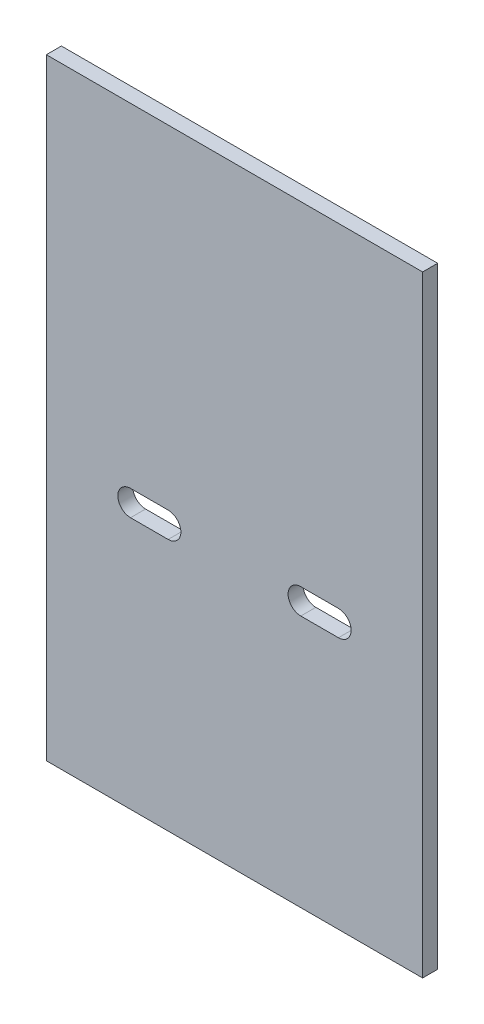
ISO-10303-21;
HEADER;
FILE_DESCRIPTION(('STEP AP214'),'2;1');
FILE_NAME('part.step','',(''),(''),'','','');
FILE_SCHEMA(('AUTOMOTIVE_DESIGN { 1 0 10303 214 1 1 1 1 }'));
ENDSEC;
DATA;
#1=APPLICATION_CONTEXT('core data for automotive mechanical design processes');
#2=APPLICATION_PROTOCOL_DEFINITION('international standard','automotive_design',2000,#1);
#3=PRODUCT_CONTEXT('',#1,'mechanical');
#4=PRODUCT('Part','Part','',(#3));
#5=PRODUCT_RELATED_PRODUCT_CATEGORY('part','',(#4));
#6=PRODUCT_DEFINITION_FORMATION('','',#4);
#7=PRODUCT_DEFINITION_CONTEXT('part definition',#1,'design');
#8=PRODUCT_DEFINITION('design','',#6,#7);
#9=PRODUCT_DEFINITION_SHAPE('','',#8);
#10=(LENGTH_UNIT() NAMED_UNIT(*) SI_UNIT(.MILLI.,.METRE.));
#11=(NAMED_UNIT(*) PLANE_ANGLE_UNIT() SI_UNIT($,.RADIAN.));
#12=(NAMED_UNIT(*) SI_UNIT($,.STERADIAN.) SOLID_ANGLE_UNIT());
#13=UNCERTAINTY_MEASURE_WITH_UNIT(LENGTH_MEASURE(1.E-05),#10,'distance_accuracy_value','');
#14=(GEOMETRIC_REPRESENTATION_CONTEXT(3) GLOBAL_UNCERTAINTY_ASSIGNED_CONTEXT((#13)) GLOBAL_UNIT_ASSIGNED_CONTEXT((#10,
#11,#12)) REPRESENTATION_CONTEXT('',''));
#15=CARTESIAN_POINT('',(0.,0.,0.));
#16=DIRECTION('',(0.,0.,1.));
#17=DIRECTION('',(1.,0.,0.));
#18=AXIS2_PLACEMENT_3D('',#15,#16,#17);
#19=CARTESIAN_POINT('',(200.,-325.,-16.));
#20=DIRECTION('',(1.,0.,0.));
#21=DIRECTION('',(0.,0.,-1.));
#22=AXIS2_PLACEMENT_3D('',#19,#20,#21);
#23=PLANE('',#22);
#24=DIRECTION('',(0.,1.,0.));
#25=VECTOR('',#24,1.);
#26=CARTESIAN_POINT('',(200.,-325.,0.));
#27=LINE('',#26,#25);
#28=CARTESIAN_POINT('',(200.,-325.,0.));
#29=VERTEX_POINT('',#28);
#30=CARTESIAN_POINT('',(200.,325.,0.));
#31=VERTEX_POINT('',#30);
#32=EDGE_CURVE('E161',#29,#31,#27,.T.);
#33=ORIENTED_EDGE('',*,*,#32,.F.);
#34=DIRECTION('',(0.,0.,1.));
#35=VECTOR('',#34,1.);
#36=CARTESIAN_POINT('',(200.,-325.,-16.));
#37=LINE('',#36,#35);
#38=CARTESIAN_POINT('',(200.,-325.,-16.));
#39=VERTEX_POINT('',#38);
#40=EDGE_CURVE('E11',#39,#29,#37,.T.);
#41=ORIENTED_EDGE('',*,*,#40,.F.);
#42=DIRECTION('',(0.,1.,0.));
#43=VECTOR('',#42,1.);
#44=CARTESIAN_POINT('',(200.,-325.,-16.));
#45=LINE('',#44,#43);
#46=CARTESIAN_POINT('',(200.,325.,-16.));
#47=VERTEX_POINT('',#46);
#48=EDGE_CURVE('E194',#39,#47,#45,.T.);
#49=ORIENTED_EDGE('',*,*,#48,.T.);
#50=DIRECTION('',(0.,0.,1.));
#51=VECTOR('',#50,1.);
#52=CARTESIAN_POINT('',(200.,325.,-16.));
#53=LINE('',#52,#51);
#54=EDGE_CURVE('E37',#47,#31,#53,.T.);
#55=ORIENTED_EDGE('',*,*,#54,.T.);
#56=EDGE_LOOP('',(#33,#41,#49,#55));
#57=FACE_BOUND('',#56,.T.);
#58=ADVANCED_FACE('F34',(#57),#23,.T.);
#59=CARTESIAN_POINT('',(-200.,-325.,-16.));
#60=DIRECTION('',(0.,-1.,0.));
#61=DIRECTION('',(0.,0.,-1.));
#62=AXIS2_PLACEMENT_3D('',#59,#60,#61);
#63=PLANE('',#62);
#64=DIRECTION('',(1.,0.,0.));
#65=VECTOR('',#64,1.);
#66=CARTESIAN_POINT('',(-200.,-325.,0.));
#67=LINE('',#66,#65);
#68=CARTESIAN_POINT('',(-200.,-325.,0.));
#69=VERTEX_POINT('',#68);
#70=EDGE_CURVE('E198',#69,#29,#67,.T.);
#71=ORIENTED_EDGE('',*,*,#70,.F.);
#72=DIRECTION('',(0.,0.,1.));
#73=VECTOR('',#72,1.);
#74=CARTESIAN_POINT('',(-200.,-325.,-16.));
#75=LINE('',#74,#73);
#76=CARTESIAN_POINT('',(-200.,-325.,-16.));
#77=VERTEX_POINT('',#76);
#78=EDGE_CURVE('E42',#77,#69,#75,.T.);
#79=ORIENTED_EDGE('',*,*,#78,.F.);
#80=DIRECTION('',(1.,0.,0.));
#81=VECTOR('',#80,1.);
#82=CARTESIAN_POINT('',(-200.,-325.,-16.));
#83=LINE('',#82,#81);
#84=EDGE_CURVE('E204',#77,#39,#83,.T.);
#85=ORIENTED_EDGE('',*,*,#84,.T.);
#86=ORIENTED_EDGE('',*,*,#40,.T.);
#87=EDGE_LOOP('',(#71,#79,#85,#86));
#88=FACE_BOUND('',#87,.T.);
#89=ADVANCED_FACE('F230',(#88),#63,.T.);
#90=CARTESIAN_POINT('',(-200.,-325.,-16.));
#91=DIRECTION('',(-1.,0.,0.));
#92=DIRECTION('',(0.,0.,1.));
#93=AXIS2_PLACEMENT_3D('',#90,#91,#92);
#94=PLANE('',#93);
#95=DIRECTION('',(0.,-1.,0.));
#96=VECTOR('',#95,1.);
#97=CARTESIAN_POINT('',(-200.,-325.,0.));
#98=LINE('',#97,#96);
#99=CARTESIAN_POINT('',(-200.,325.,0.));
#100=VERTEX_POINT('',#99);
#101=EDGE_CURVE('E212',#100,#69,#98,.T.);
#102=ORIENTED_EDGE('',*,*,#101,.F.);
#103=DIRECTION('',(0.,0.,1.));
#104=VECTOR('',#103,1.);
#105=CARTESIAN_POINT('',(-200.,325.,-16.));
#106=LINE('',#105,#104);
#107=CARTESIAN_POINT('',(-200.,325.,-16.));
#108=VERTEX_POINT('',#107);
#109=EDGE_CURVE('E217',#108,#100,#106,.T.);
#110=ORIENTED_EDGE('',*,*,#109,.F.);
#111=DIRECTION('',(0.,-1.,0.));
#112=VECTOR('',#111,1.);
#113=CARTESIAN_POINT('',(-200.,-325.,-16.));
#114=LINE('',#113,#112);
#115=EDGE_CURVE('E201',#108,#77,#114,.T.);
#116=ORIENTED_EDGE('',*,*,#115,.T.);
#117=ORIENTED_EDGE('',*,*,#78,.T.);
#118=EDGE_LOOP('',(#102,#110,#116,#117));
#119=FACE_BOUND('',#118,.T.);
#120=ADVANCED_FACE('F235',(#119),#94,.T.);
#121=CARTESIAN_POINT('',(-200.,325.,-16.));
#122=DIRECTION('',(0.,1.,0.));
#123=DIRECTION('',(0.,0.,1.));
#124=AXIS2_PLACEMENT_3D('',#121,#122,#123);
#125=PLANE('',#124);
#126=DIRECTION('',(-1.,0.,0.));
#127=VECTOR('',#126,1.);
#128=CARTESIAN_POINT('',(-200.,325.,0.));
#129=LINE('',#128,#127);
#130=EDGE_CURVE('E209',#31,#100,#129,.T.);
#131=ORIENTED_EDGE('',*,*,#130,.F.);
#132=ORIENTED_EDGE('',*,*,#54,.F.);
#133=DIRECTION('',(-1.,0.,0.));
#134=VECTOR('',#133,1.);
#135=CARTESIAN_POINT('',(-200.,325.,-16.));
#136=LINE('',#135,#134);
#137=EDGE_CURVE('E197',#47,#108,#136,.T.);
#138=ORIENTED_EDGE('',*,*,#137,.T.);
#139=ORIENTED_EDGE('',*,*,#109,.T.);
#140=EDGE_LOOP('',(#131,#132,#138,#139));
#141=FACE_BOUND('',#140,.T.);
#142=ADVANCED_FACE('F225',(#141),#125,.T.);
#143=CARTESIAN_POINT('',(0.,0.,-16.));
#144=DIRECTION('',(0.,0.,-1.));
#145=DIRECTION('',(-1.,0.,0.));
#146=AXIS2_PLACEMENT_3D('',#143,#144,#145);
#147=PLANE('',#146);
#148=CARTESIAN_POINT('',(70.5,-43.,-16.));
#149=DIRECTION('',(0.,0.,1.));
#150=DIRECTION('',(1.,0.,0.));
#151=AXIS2_PLACEMENT_3D('',#148,#149,#150);
#152=CIRCLE('',#151,13.5);
#153=CARTESIAN_POINT('',(70.5,-29.5,-16.));
#154=VERTEX_POINT('',#153);
#155=CARTESIAN_POINT('',(70.5,-56.5,-16.));
#156=VERTEX_POINT('',#155);
#157=EDGE_CURVE('E127',#154,#156,#152,.T.);
#158=ORIENTED_EDGE('',*,*,#157,.T.);
#159=DIRECTION('',(1.,0.,0.));
#160=VECTOR('',#159,1.);
#161=CARTESIAN_POINT('',(70.5,-56.5,-16.));
#162=LINE('',#161,#160);
#163=CARTESIAN_POINT('',(110.5,-56.5,-16.));
#164=VERTEX_POINT('',#163);
#165=EDGE_CURVE('E138',#156,#164,#162,.T.);
#166=ORIENTED_EDGE('',*,*,#165,.T.);
#167=CARTESIAN_POINT('',(110.5,-43.,-16.));
#168=DIRECTION('',(0.,0.,1.));
#169=DIRECTION('',(1.,0.,0.));
#170=AXIS2_PLACEMENT_3D('',#167,#168,#169);
#171=CIRCLE('',#170,13.5);
#172=CARTESIAN_POINT('',(110.5,-29.5,-16.));
#173=VERTEX_POINT('',#172);
#174=EDGE_CURVE('E50',#164,#173,#171,.T.);
#175=ORIENTED_EDGE('',*,*,#174,.T.);
#176=DIRECTION('',(-1.,0.,0.));
#177=VECTOR('',#176,1.);
#178=CARTESIAN_POINT('',(70.5,-29.5,-16.));
#179=LINE('',#178,#177);
#180=EDGE_CURVE('E135',#173,#154,#179,.T.);
#181=ORIENTED_EDGE('',*,*,#180,.T.);
#182=EDGE_LOOP('',(#158,#166,#175,#181));
#183=FACE_BOUND('',#182,.T.);
#184=CARTESIAN_POINT('',(-70.5,-43.,-16.));
#185=DIRECTION('',(0.,0.,1.));
#186=DIRECTION('',(1.,0.,0.));
#187=AXIS2_PLACEMENT_3D('',#184,#185,#186);
#188=CIRCLE('',#187,13.5);
#189=CARTESIAN_POINT('',(-70.5,-56.5,-16.));
#190=VERTEX_POINT('',#189);
#191=CARTESIAN_POINT('',(-70.5,-29.5,-16.));
#192=VERTEX_POINT('',#191);
#193=EDGE_CURVE('E165',#190,#192,#188,.T.);
#194=ORIENTED_EDGE('',*,*,#193,.T.);
#195=DIRECTION('',(-1.,0.,0.));
#196=VECTOR('',#195,1.);
#197=CARTESIAN_POINT('',(-70.5,-29.5,-16.));
#198=LINE('',#197,#196);
#199=CARTESIAN_POINT('',(-110.5,-29.5,-16.));
#200=VERTEX_POINT('',#199);
#201=EDGE_CURVE('E168',#192,#200,#198,.T.);
#202=ORIENTED_EDGE('',*,*,#201,.T.);
#203=CARTESIAN_POINT('',(-110.5,-43.,-16.));
#204=DIRECTION('',(0.,0.,1.));
#205=DIRECTION('',(1.,0.,0.));
#206=AXIS2_PLACEMENT_3D('',#203,#204,#205);
#207=CIRCLE('',#206,13.5);
#208=CARTESIAN_POINT('',(-110.5,-56.5,-16.));
#209=VERTEX_POINT('',#208);
#210=EDGE_CURVE('E58',#200,#209,#207,.T.);
#211=ORIENTED_EDGE('',*,*,#210,.T.);
#212=DIRECTION('',(1.,0.,0.));
#213=VECTOR('',#212,1.);
#214=CARTESIAN_POINT('',(-70.5,-56.5,-16.));
#215=LINE('',#214,#213);
#216=EDGE_CURVE('E173',#209,#190,#215,.T.);
#217=ORIENTED_EDGE('',*,*,#216,.T.);
#218=EDGE_LOOP('',(#194,#202,#211,#217));
#219=FACE_BOUND('',#218,.T.);
#220=ORIENTED_EDGE('',*,*,#48,.F.);
#221=ORIENTED_EDGE('',*,*,#84,.F.);
#222=ORIENTED_EDGE('',*,*,#115,.F.);
#223=ORIENTED_EDGE('',*,*,#137,.F.);
#224=EDGE_LOOP('',(#220,#221,#222,#223));
#225=FACE_BOUND('',#224,.T.);
#226=ADVANCED_FACE('F142',(#183,#219,#225),#147,.T.);
#227=CARTESIAN_POINT('',(0.,0.,0.));
#228=DIRECTION('',(0.,0.,-1.));
#229=DIRECTION('',(-1.,0.,0.));
#230=AXIS2_PLACEMENT_3D('',#227,#228,#229);
#231=PLANE('',#230);
#232=DIRECTION('',(1.,0.,0.));
#233=VECTOR('',#232,1.);
#234=CARTESIAN_POINT('',(70.5,-56.5,0.));
#235=LINE('',#234,#233);
#236=CARTESIAN_POINT('',(70.5,-56.5,0.));
#237=VERTEX_POINT('',#236);
#238=CARTESIAN_POINT('',(110.5,-56.5,0.));
#239=VERTEX_POINT('',#238);
#240=EDGE_CURVE('E154',#237,#239,#235,.T.);
#241=ORIENTED_EDGE('',*,*,#240,.F.);
#242=CARTESIAN_POINT('',(70.5,-43.,0.));
#243=DIRECTION('',(0.,0.,1.));
#244=DIRECTION('',(1.,0.,0.));
#245=AXIS2_PLACEMENT_3D('',#242,#243,#244);
#246=CIRCLE('',#245,13.5);
#247=CARTESIAN_POINT('',(70.5,-29.5,0.));
#248=VERTEX_POINT('',#247);
#249=EDGE_CURVE('E130',#248,#237,#246,.T.);
#250=ORIENTED_EDGE('',*,*,#249,.F.);
#251=DIRECTION('',(-1.,0.,0.));
#252=VECTOR('',#251,1.);
#253=CARTESIAN_POINT('',(70.5,-29.5,0.));
#254=LINE('',#253,#252);
#255=CARTESIAN_POINT('',(110.5,-29.5,0.));
#256=VERTEX_POINT('',#255);
#257=EDGE_CURVE('E145',#256,#248,#254,.T.);
#258=ORIENTED_EDGE('',*,*,#257,.F.);
#259=CARTESIAN_POINT('',(110.5,-43.,0.));
#260=DIRECTION('',(0.,0.,1.));
#261=DIRECTION('',(1.,0.,0.));
#262=AXIS2_PLACEMENT_3D('',#259,#260,#261);
#263=CIRCLE('',#262,13.5);
#264=EDGE_CURVE('E148',#239,#256,#263,.T.);
#265=ORIENTED_EDGE('',*,*,#264,.F.);
#266=EDGE_LOOP('',(#241,#250,#258,#265));
#267=FACE_BOUND('',#266,.T.);
#268=DIRECTION('',(-1.,0.,0.));
#269=VECTOR('',#268,1.);
#270=CARTESIAN_POINT('',(-70.5,-29.5,0.));
#271=LINE('',#270,#269);
#272=CARTESIAN_POINT('',(-70.5,-29.5,0.));
#273=VERTEX_POINT('',#272);
#274=CARTESIAN_POINT('',(-110.5,-29.5,0.));
#275=VERTEX_POINT('',#274);
#276=EDGE_CURVE('E179',#273,#275,#271,.T.);
#277=ORIENTED_EDGE('',*,*,#276,.F.);
#278=CARTESIAN_POINT('',(-70.5,-43.,0.));
#279=DIRECTION('',(0.,0.,1.));
#280=DIRECTION('',(1.,0.,0.));
#281=AXIS2_PLACEMENT_3D('',#278,#279,#280);
#282=CIRCLE('',#281,13.5);
#283=CARTESIAN_POINT('',(-70.5,-56.5,0.));
#284=VERTEX_POINT('',#283);
#285=EDGE_CURVE('E177',#284,#273,#282,.T.);
#286=ORIENTED_EDGE('',*,*,#285,.F.);
#287=DIRECTION('',(1.,0.,0.));
#288=VECTOR('',#287,1.);
#289=CARTESIAN_POINT('',(-70.5,-56.5,0.));
#290=LINE('',#289,#288);
#291=CARTESIAN_POINT('',(-110.5,-56.5,0.));
#292=VERTEX_POINT('',#291);
#293=EDGE_CURVE('E169',#292,#284,#290,.T.);
#294=ORIENTED_EDGE('',*,*,#293,.F.);
#295=CARTESIAN_POINT('',(-110.5,-43.,0.));
#296=DIRECTION('',(0.,0.,1.));
#297=DIRECTION('',(1.,0.,0.));
#298=AXIS2_PLACEMENT_3D('',#295,#296,#297);
#299=CIRCLE('',#298,13.5);
#300=EDGE_CURVE('E182',#275,#292,#299,.T.);
#301=ORIENTED_EDGE('',*,*,#300,.F.);
#302=EDGE_LOOP('',(#277,#286,#294,#301));
#303=FACE_BOUND('',#302,.T.);
#304=ORIENTED_EDGE('',*,*,#32,.T.);
#305=ORIENTED_EDGE('',*,*,#130,.T.);
#306=ORIENTED_EDGE('',*,*,#101,.T.);
#307=ORIENTED_EDGE('',*,*,#70,.T.);
#308=EDGE_LOOP('',(#304,#305,#306,#307));
#309=FACE_BOUND('',#308,.T.);
#310=ADVANCED_FACE('F227',(#267,#303,#309),#231,.F.);
#311=CARTESIAN_POINT('',(-70.5,-43.,-16.));
#312=DIRECTION('',(0.,0.,1.));
#313=DIRECTION('',(1.,0.,0.));
#314=AXIS2_PLACEMENT_3D('',#311,#312,#313);
#315=CYLINDRICAL_SURFACE('',#314,13.5);
#316=ORIENTED_EDGE('',*,*,#285,.T.);
#317=DIRECTION('',(0.,0.,1.));
#318=VECTOR('',#317,1.);
#319=CARTESIAN_POINT('',(-70.5,-29.5,-16.));
#320=LINE('',#319,#318);
#321=EDGE_CURVE('E176',#192,#273,#320,.T.);
#322=ORIENTED_EDGE('',*,*,#321,.F.);
#323=ORIENTED_EDGE('',*,*,#193,.F.);
#324=DIRECTION('',(0.,0.,1.));
#325=VECTOR('',#324,1.);
#326=CARTESIAN_POINT('',(-70.5,-56.5,-16.));
#327=LINE('',#326,#325);
#328=EDGE_CURVE('E155',#190,#284,#327,.T.);
#329=ORIENTED_EDGE('',*,*,#328,.T.);
#330=EDGE_LOOP('',(#316,#322,#323,#329));
#331=FACE_BOUND('',#330,.T.);
#332=ADVANCED_FACE('F277',(#331),#315,.F.);
#333=CARTESIAN_POINT('',(-70.5,-56.5,-16.));
#334=DIRECTION('',(0.,-1.,0.));
#335=DIRECTION('',(1.,0.,0.));
#336=AXIS2_PLACEMENT_3D('',#333,#334,#335);
#337=PLANE('',#336);
#338=ORIENTED_EDGE('',*,*,#293,.T.);
#339=ORIENTED_EDGE('',*,*,#328,.F.);
#340=ORIENTED_EDGE('',*,*,#216,.F.);
#341=DIRECTION('',(0.,0.,1.));
#342=VECTOR('',#341,1.);
#343=CARTESIAN_POINT('',(-110.5,-56.5,-16.));
#344=LINE('',#343,#342);
#345=EDGE_CURVE('E188',#209,#292,#344,.T.);
#346=ORIENTED_EDGE('',*,*,#345,.T.);
#347=EDGE_LOOP('',(#338,#339,#340,#346));
#348=FACE_BOUND('',#347,.T.);
#349=ADVANCED_FACE('F287',(#348),#337,.F.);
#350=CARTESIAN_POINT('',(-110.5,-43.,-16.));
#351=DIRECTION('',(0.,0.,1.));
#352=DIRECTION('',(1.,0.,0.));
#353=AXIS2_PLACEMENT_3D('',#350,#351,#352);
#354=CYLINDRICAL_SURFACE('',#353,13.5);
#355=ORIENTED_EDGE('',*,*,#300,.T.);
#356=ORIENTED_EDGE('',*,*,#345,.F.);
#357=ORIENTED_EDGE('',*,*,#210,.F.);
#358=DIRECTION('',(0.,0.,1.));
#359=VECTOR('',#358,1.);
#360=CARTESIAN_POINT('',(-110.5,-29.5,-16.));
#361=LINE('',#360,#359);
#362=EDGE_CURVE('E190',#200,#275,#361,.T.);
#363=ORIENTED_EDGE('',*,*,#362,.T.);
#364=EDGE_LOOP('',(#355,#356,#357,#363));
#365=FACE_BOUND('',#364,.T.);
#366=ADVANCED_FACE('F297',(#365),#354,.F.);
#367=CARTESIAN_POINT('',(-70.5,-29.5,-16.));
#368=DIRECTION('',(0.,1.,0.));
#369=DIRECTION('',(-1.,0.,0.));
#370=AXIS2_PLACEMENT_3D('',#367,#368,#369);
#371=PLANE('',#370);
#372=ORIENTED_EDGE('',*,*,#276,.T.);
#373=ORIENTED_EDGE('',*,*,#362,.F.);
#374=ORIENTED_EDGE('',*,*,#201,.F.);
#375=ORIENTED_EDGE('',*,*,#321,.T.);
#376=EDGE_LOOP('',(#372,#373,#374,#375));
#377=FACE_BOUND('',#376,.T.);
#378=ADVANCED_FACE('F307',(#377),#371,.F.);
#379=CARTESIAN_POINT('',(70.5,-43.,-16.));
#380=DIRECTION('',(0.,0.,1.));
#381=DIRECTION('',(1.,0.,0.));
#382=AXIS2_PLACEMENT_3D('',#379,#380,#381);
#383=CYLINDRICAL_SURFACE('',#382,13.5);
#384=ORIENTED_EDGE('',*,*,#249,.T.);
#385=DIRECTION('',(0.,0.,1.));
#386=VECTOR('',#385,1.);
#387=CARTESIAN_POINT('',(70.5,-56.5,-16.));
#388=LINE('',#387,#386);
#389=EDGE_CURVE('E123',#156,#237,#388,.T.);
#390=ORIENTED_EDGE('',*,*,#389,.F.);
#391=ORIENTED_EDGE('',*,*,#157,.F.);
#392=DIRECTION('',(0.,0.,1.));
#393=VECTOR('',#392,1.);
#394=CARTESIAN_POINT('',(70.5,-29.5,-16.));
#395=LINE('',#394,#393);
#396=EDGE_CURVE('E159',#154,#248,#395,.T.);
#397=ORIENTED_EDGE('',*,*,#396,.T.);
#398=EDGE_LOOP('',(#384,#390,#391,#397));
#399=FACE_BOUND('',#398,.T.);
#400=ADVANCED_FACE('F125',(#399),#383,.F.);
#401=CARTESIAN_POINT('',(70.5,-29.5,-16.));
#402=DIRECTION('',(0.,1.,0.));
#403=DIRECTION('',(-1.,0.,0.));
#404=AXIS2_PLACEMENT_3D('',#401,#402,#403);
#405=PLANE('',#404);
#406=ORIENTED_EDGE('',*,*,#257,.T.);
#407=ORIENTED_EDGE('',*,*,#396,.F.);
#408=ORIENTED_EDGE('',*,*,#180,.F.);
#409=DIRECTION('',(0.,0.,1.));
#410=VECTOR('',#409,1.);
#411=CARTESIAN_POINT('',(110.5,-29.5,-16.));
#412=LINE('',#411,#410);
#413=EDGE_CURVE('E162',#173,#256,#412,.T.);
#414=ORIENTED_EDGE('',*,*,#413,.T.);
#415=EDGE_LOOP('',(#406,#407,#408,#414));
#416=FACE_BOUND('',#415,.T.);
#417=ADVANCED_FACE('F325',(#416),#405,.F.);
#418=CARTESIAN_POINT('',(110.5,-43.,-16.));
#419=DIRECTION('',(0.,0.,1.));
#420=DIRECTION('',(1.,0.,0.));
#421=AXIS2_PLACEMENT_3D('',#418,#419,#420);
#422=CYLINDRICAL_SURFACE('',#421,13.5);
#423=ORIENTED_EDGE('',*,*,#264,.T.);
#424=ORIENTED_EDGE('',*,*,#413,.F.);
#425=ORIENTED_EDGE('',*,*,#174,.F.);
#426=DIRECTION('',(0.,0.,1.));
#427=VECTOR('',#426,1.);
#428=CARTESIAN_POINT('',(110.5,-56.5,-16.));
#429=LINE('',#428,#427);
#430=EDGE_CURVE('E134',#164,#239,#429,.T.);
#431=ORIENTED_EDGE('',*,*,#430,.T.);
#432=EDGE_LOOP('',(#423,#424,#425,#431));
#433=FACE_BOUND('',#432,.T.);
#434=ADVANCED_FACE('F334',(#433),#422,.F.);
#435=CARTESIAN_POINT('',(70.5,-56.5,-16.));
#436=DIRECTION('',(0.,-1.,0.));
#437=DIRECTION('',(1.,0.,0.));
#438=AXIS2_PLACEMENT_3D('',#435,#436,#437);
#439=PLANE('',#438);
#440=ORIENTED_EDGE('',*,*,#240,.T.);
#441=ORIENTED_EDGE('',*,*,#430,.F.);
#442=ORIENTED_EDGE('',*,*,#165,.F.);
#443=ORIENTED_EDGE('',*,*,#389,.T.);
#444=EDGE_LOOP('',(#440,#441,#442,#443));
#445=FACE_BOUND('',#444,.T.);
#446=ADVANCED_FACE('F139',(#445),#439,.F.);
#447=CLOSED_SHELL('',(#58,#89,#120,#142,#226,#310,#332,#349,#366,#378,#400,#417,#434,#446));
#448=MANIFOLD_SOLID_BREP('B2',#447);
#449=ADVANCED_BREP_SHAPE_REPRESENTATION('',(#18,#448),#14);
#450=SHAPE_DEFINITION_REPRESENTATION(#9,#449);
ENDSEC;
END-ISO-10303-21;
